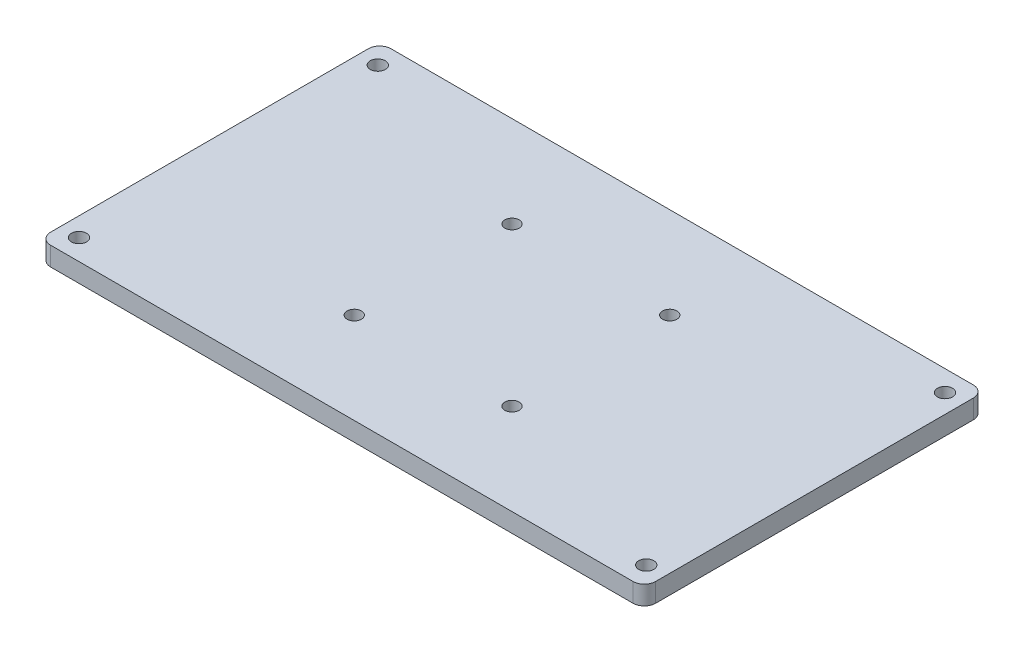
ISO-10303-21;
HEADER;
FILE_DESCRIPTION(('STEP AP214'),'2;1');
FILE_NAME('part.step','',(''),(''),'','','');
FILE_SCHEMA(('AUTOMOTIVE_DESIGN { 1 0 10303 214 1 1 1 1 }'));
ENDSEC;
DATA;
#1=APPLICATION_CONTEXT('core data for automotive mechanical design processes');
#2=APPLICATION_PROTOCOL_DEFINITION('international standard','automotive_design',2000,#1);
#3=PRODUCT_CONTEXT('',#1,'mechanical');
#4=PRODUCT('Part','Part','',(#3));
#5=PRODUCT_RELATED_PRODUCT_CATEGORY('part','',(#4));
#6=PRODUCT_DEFINITION_FORMATION('','',#4);
#7=PRODUCT_DEFINITION_CONTEXT('part definition',#1,'design');
#8=PRODUCT_DEFINITION('design','',#6,#7);
#9=PRODUCT_DEFINITION_SHAPE('','',#8);
#10=(LENGTH_UNIT() NAMED_UNIT(*) SI_UNIT(.MILLI.,.METRE.));
#11=(NAMED_UNIT(*) PLANE_ANGLE_UNIT() SI_UNIT($,.RADIAN.));
#12=(NAMED_UNIT(*) SI_UNIT($,.STERADIAN.) SOLID_ANGLE_UNIT());
#13=UNCERTAINTY_MEASURE_WITH_UNIT(LENGTH_MEASURE(1.E-05),#10,'distance_accuracy_value','');
#14=(GEOMETRIC_REPRESENTATION_CONTEXT(3) GLOBAL_UNCERTAINTY_ASSIGNED_CONTEXT((#13)) GLOBAL_UNIT_ASSIGNED_CONTEXT((#10,
#11,#12)) REPRESENTATION_CONTEXT('',''));
#15=CARTESIAN_POINT('',(0.,0.,0.));
#16=DIRECTION('',(0.,0.,1.));
#17=DIRECTION('',(1.,0.,0.));
#18=AXIS2_PLACEMENT_3D('',#15,#16,#17);
#19=CARTESIAN_POINT('',(0.,5.,0.));
#20=DIRECTION('',(0.,-1.,0.));
#21=DIRECTION('',(0.,0.,-1.));
#22=AXIS2_PLACEMENT_3D('',#19,#20,#21);
#23=PLANE('',#22);
#24=DIRECTION('',(-1.,0.,0.));
#25=VECTOR('',#24,1.);
#26=CARTESIAN_POINT('',(-80.,5.,-45.));
#27=LINE('',#26,#25);
#28=CARTESIAN_POINT('',(77.,5.,-45.));
#29=VERTEX_POINT('',#28);
#30=CARTESIAN_POINT('',(-77.,5.,-45.));
#31=VERTEX_POINT('',#30);
#32=EDGE_CURVE('E183',#29,#31,#27,.T.);
#33=ORIENTED_EDGE('',*,*,#32,.T.);
#34=CARTESIAN_POINT('',(-77.,5.,-42.));
#35=DIRECTION('',(0.,-1.,0.));
#36=DIRECTION('',(0.,0.,-1.));
#37=AXIS2_PLACEMENT_3D('',#34,#35,#36);
#38=CIRCLE('',#37,3.);
#39=CARTESIAN_POINT('',(-80.,5.,-42.));
#40=VERTEX_POINT('',#39);
#41=EDGE_CURVE('E169',#31,#40,#38,.F.);
#42=ORIENTED_EDGE('',*,*,#41,.T.);
#43=DIRECTION('',(0.,0.,1.));
#44=VECTOR('',#43,1.);
#45=CARTESIAN_POINT('',(-80.,5.,45.));
#46=LINE('',#45,#44);
#47=CARTESIAN_POINT('',(-80.,5.,42.));
#48=VERTEX_POINT('',#47);
#49=EDGE_CURVE('E126',#40,#48,#46,.T.);
#50=ORIENTED_EDGE('',*,*,#49,.T.);
#51=CARTESIAN_POINT('',(-77.,5.,42.));
#52=DIRECTION('',(0.,-1.,0.));
#53=DIRECTION('',(0.,0.,-1.));
#54=AXIS2_PLACEMENT_3D('',#51,#52,#53);
#55=CIRCLE('',#54,3.);
#56=CARTESIAN_POINT('',(-77.,5.,45.));
#57=VERTEX_POINT('',#56);
#58=EDGE_CURVE('E61',#48,#57,#55,.F.);
#59=ORIENTED_EDGE('',*,*,#58,.T.);
#60=DIRECTION('',(1.,0.,0.));
#61=VECTOR('',#60,1.);
#62=CARTESIAN_POINT('',(-80.,5.,45.));
#63=LINE('',#62,#61);
#64=CARTESIAN_POINT('',(77.,5.,45.));
#65=VERTEX_POINT('',#64);
#66=EDGE_CURVE('E148',#57,#65,#63,.T.);
#67=ORIENTED_EDGE('',*,*,#66,.T.);
#68=CARTESIAN_POINT('',(77.,5.,42.));
#69=DIRECTION('',(0.,-1.,0.));
#70=DIRECTION('',(0.,0.,-1.));
#71=AXIS2_PLACEMENT_3D('',#68,#69,#70);
#72=CIRCLE('',#71,3.);
#73=CARTESIAN_POINT('',(80.,5.,42.));
#74=VERTEX_POINT('',#73);
#75=EDGE_CURVE('E161',#65,#74,#72,.F.);
#76=ORIENTED_EDGE('',*,*,#75,.T.);
#77=DIRECTION('',(0.,0.,-1.));
#78=VECTOR('',#77,1.);
#79=CARTESIAN_POINT('',(80.,5.,45.));
#80=LINE('',#79,#78);
#81=CARTESIAN_POINT('',(80.,5.,-42.));
#82=VERTEX_POINT('',#81);
#83=EDGE_CURVE('E141',#74,#82,#80,.T.);
#84=ORIENTED_EDGE('',*,*,#83,.T.);
#85=CARTESIAN_POINT('',(77.,5.,-42.));
#86=DIRECTION('',(0.,-1.,0.));
#87=DIRECTION('',(0.,0.,-1.));
#88=AXIS2_PLACEMENT_3D('',#85,#86,#87);
#89=CIRCLE('',#88,3.);
#90=EDGE_CURVE('E166',#82,#29,#89,.F.);
#91=ORIENTED_EDGE('',*,*,#90,.T.);
#92=EDGE_LOOP('',(#33,#42,#50,#59,#67,#76,#84,#91));
#93=FACE_BOUND('',#92,.T.);
#94=CARTESIAN_POINT('',(20.859650045003,5.,-20.8596500450033));
#95=DIRECTION('',(0.,1.,0.));
#96=DIRECTION('',(0.,0.,1.));
#97=AXIS2_PLACEMENT_3D('',#94,#95,#96);
#98=CIRCLE('',#97,1.90000000000001);
#99=CARTESIAN_POINT('',(20.859650045003,5.,-18.9596500450033));
#100=VERTEX_POINT('',#99);
#101=EDGE_CURVE('E197',#100,#100,#98,.T.);
#102=ORIENTED_EDGE('',*,*,#101,.F.);
#103=EDGE_LOOP('',(#102));
#104=FACE_BOUND('',#103,.T.);
#105=CARTESIAN_POINT('',(20.8596500450044,5.,20.859650045003));
#106=DIRECTION('',(0.,1.,0.));
#107=DIRECTION('',(0.,0.,1.));
#108=AXIS2_PLACEMENT_3D('',#105,#106,#107);
#109=CIRCLE('',#108,1.9);
#110=CARTESIAN_POINT('',(20.8596500450044,5.,22.759650045003));
#111=VERTEX_POINT('',#110);
#112=EDGE_CURVE('E207',#111,#111,#109,.T.);
#113=ORIENTED_EDGE('',*,*,#112,.F.);
#114=EDGE_LOOP('',(#113));
#115=FACE_BOUND('',#114,.T.);
#116=CARTESIAN_POINT('',(-20.8596500450019,5.,20.8596500450044));
#117=DIRECTION('',(0.,1.,0.));
#118=DIRECTION('',(0.,0.,1.));
#119=AXIS2_PLACEMENT_3D('',#116,#117,#118);
#120=CIRCLE('',#119,1.9);
#121=CARTESIAN_POINT('',(-20.8596500450019,5.,22.7596500450044));
#122=VERTEX_POINT('',#121);
#123=EDGE_CURVE('E213',#122,#122,#120,.T.);
#124=ORIENTED_EDGE('',*,*,#123,.F.);
#125=EDGE_LOOP('',(#124));
#126=FACE_BOUND('',#125,.T.);
#127=CARTESIAN_POINT('',(-20.8596500450033,5.,-20.8596500450019));
#128=DIRECTION('',(0.,1.,0.));
#129=DIRECTION('',(0.,0.,1.));
#130=AXIS2_PLACEMENT_3D('',#127,#128,#129);
#131=CIRCLE('',#130,1.9);
#132=CARTESIAN_POINT('',(-20.8596500450033,5.,-18.9596500450019));
#133=VERTEX_POINT('',#132);
#134=EDGE_CURVE('E221',#133,#133,#131,.T.);
#135=ORIENTED_EDGE('',*,*,#134,.F.);
#136=EDGE_LOOP('',(#135));
#137=FACE_BOUND('',#136,.T.);
#138=CARTESIAN_POINT('',(-75.,5.,-39.5));
#139=DIRECTION('',(0.,1.,0.));
#140=DIRECTION('',(0.,0.,1.));
#141=AXIS2_PLACEMENT_3D('',#138,#139,#140);
#142=CIRCLE('',#141,2.);
#143=CARTESIAN_POINT('',(-75.,5.,-37.5));
#144=VERTEX_POINT('',#143);
#145=EDGE_CURVE('E229',#144,#144,#142,.T.);
#146=ORIENTED_EDGE('',*,*,#145,.F.);
#147=EDGE_LOOP('',(#146));
#148=FACE_BOUND('',#147,.T.);
#149=CARTESIAN_POINT('',(75.,5.,-39.5));
#150=DIRECTION('',(0.,1.,0.));
#151=DIRECTION('',(0.,0.,1.));
#152=AXIS2_PLACEMENT_3D('',#149,#150,#151);
#153=CIRCLE('',#152,2.);
#154=CARTESIAN_POINT('',(75.,5.,-37.5));
#155=VERTEX_POINT('',#154);
#156=EDGE_CURVE('E237',#155,#155,#153,.T.);
#157=ORIENTED_EDGE('',*,*,#156,.F.);
#158=EDGE_LOOP('',(#157));
#159=FACE_BOUND('',#158,.T.);
#160=CARTESIAN_POINT('',(75.,5.,39.5));
#161=DIRECTION('',(0.,1.,0.));
#162=DIRECTION('',(0.,0.,1.));
#163=AXIS2_PLACEMENT_3D('',#160,#161,#162);
#164=CIRCLE('',#163,2.);
#165=CARTESIAN_POINT('',(75.,5.,41.5));
#166=VERTEX_POINT('',#165);
#167=EDGE_CURVE('E245',#166,#166,#164,.T.);
#168=ORIENTED_EDGE('',*,*,#167,.F.);
#169=EDGE_LOOP('',(#168));
#170=FACE_BOUND('',#169,.T.);
#171=CARTESIAN_POINT('',(-75.,5.,39.5));
#172=DIRECTION('',(0.,1.,0.));
#173=DIRECTION('',(0.,0.,1.));
#174=AXIS2_PLACEMENT_3D('',#171,#172,#173);
#175=CIRCLE('',#174,2.);
#176=CARTESIAN_POINT('',(-75.,5.,41.5));
#177=VERTEX_POINT('',#176);
#178=EDGE_CURVE('E253',#177,#177,#175,.T.);
#179=ORIENTED_EDGE('',*,*,#178,.F.);
#180=EDGE_LOOP('',(#179));
#181=FACE_BOUND('',#180,.T.);
#182=ADVANCED_FACE('F39',(#93,#104,#115,#126,#137,#148,#159,#170,#181),#23,.F.);
#183=CARTESIAN_POINT('',(0.,0.,0.));
#184=DIRECTION('',(0.,-1.,0.));
#185=DIRECTION('',(0.,0.,-1.));
#186=AXIS2_PLACEMENT_3D('',#183,#184,#185);
#187=PLANE('',#186);
#188=CARTESIAN_POINT('',(75.,0.,39.5));
#189=DIRECTION('',(0.,1.,0.));
#190=DIRECTION('',(0.,0.,1.));
#191=AXIS2_PLACEMENT_3D('',#188,#189,#190);
#192=CIRCLE('',#191,2.);
#193=CARTESIAN_POINT('',(75.,0.,41.5));
#194=VERTEX_POINT('',#193);
#195=EDGE_CURVE('E249',#194,#194,#192,.T.);
#196=ORIENTED_EDGE('',*,*,#195,.T.);
#197=EDGE_LOOP('',(#196));
#198=FACE_BOUND('',#197,.T.);
#199=CARTESIAN_POINT('',(-75.,0.,-39.5));
#200=DIRECTION('',(0.,1.,0.));
#201=DIRECTION('',(0.,0.,1.));
#202=AXIS2_PLACEMENT_3D('',#199,#200,#201);
#203=CIRCLE('',#202,2.);
#204=CARTESIAN_POINT('',(-75.,0.,-37.5));
#205=VERTEX_POINT('',#204);
#206=EDGE_CURVE('E233',#205,#205,#203,.T.);
#207=ORIENTED_EDGE('',*,*,#206,.T.);
#208=EDGE_LOOP('',(#207));
#209=FACE_BOUND('',#208,.T.);
#210=CARTESIAN_POINT('',(-20.8596500450019,0.,20.8596500450044));
#211=DIRECTION('',(0.,1.,0.));
#212=DIRECTION('',(0.,0.,1.));
#213=AXIS2_PLACEMENT_3D('',#210,#211,#212);
#214=CIRCLE('',#213,1.9);
#215=CARTESIAN_POINT('',(-20.8596500450019,0.,22.7596500450044));
#216=VERTEX_POINT('',#215);
#217=EDGE_CURVE('E217',#216,#216,#214,.T.);
#218=ORIENTED_EDGE('',*,*,#217,.T.);
#219=EDGE_LOOP('',(#218));
#220=FACE_BOUND('',#219,.T.);
#221=CARTESIAN_POINT('',(20.859650045003,0.,-20.8596500450033));
#222=DIRECTION('',(0.,1.,0.));
#223=DIRECTION('',(0.,0.,1.));
#224=AXIS2_PLACEMENT_3D('',#221,#222,#223);
#225=CIRCLE('',#224,1.90000000000001);
#226=CARTESIAN_POINT('',(20.859650045003,0.,-18.9596500450033));
#227=VERTEX_POINT('',#226);
#228=EDGE_CURVE('E193',#227,#227,#225,.T.);
#229=ORIENTED_EDGE('',*,*,#228,.T.);
#230=EDGE_LOOP('',(#229));
#231=FACE_BOUND('',#230,.T.);
#232=DIRECTION('',(0.,0.,1.));
#233=VECTOR('',#232,1.);
#234=CARTESIAN_POINT('',(-80.,0.,45.));
#235=LINE('',#234,#233);
#236=CARTESIAN_POINT('',(-80.,0.,-42.));
#237=VERTEX_POINT('',#236);
#238=CARTESIAN_POINT('',(-80.,0.,42.));
#239=VERTEX_POINT('',#238);
#240=EDGE_CURVE('E124',#237,#239,#235,.T.);
#241=ORIENTED_EDGE('',*,*,#240,.F.);
#242=CARTESIAN_POINT('',(-77.,0.,-42.));
#243=DIRECTION('',(0.,-1.,0.));
#244=DIRECTION('',(0.,0.,-1.));
#245=AXIS2_PLACEMENT_3D('',#242,#243,#244);
#246=CIRCLE('',#245,3.);
#247=CARTESIAN_POINT('',(-77.,0.,-45.));
#248=VERTEX_POINT('',#247);
#249=EDGE_CURVE('E106',#237,#248,#246,.T.);
#250=ORIENTED_EDGE('',*,*,#249,.T.);
#251=DIRECTION('',(-1.,0.,0.));
#252=VECTOR('',#251,1.);
#253=CARTESIAN_POINT('',(-80.,0.,-45.));
#254=LINE('',#253,#252);
#255=CARTESIAN_POINT('',(77.,0.,-45.));
#256=VERTEX_POINT('',#255);
#257=EDGE_CURVE('E137',#256,#248,#254,.T.);
#258=ORIENTED_EDGE('',*,*,#257,.F.);
#259=CARTESIAN_POINT('',(77.,0.,-42.));
#260=DIRECTION('',(0.,-1.,0.));
#261=DIRECTION('',(0.,0.,-1.));
#262=AXIS2_PLACEMENT_3D('',#259,#260,#261);
#263=CIRCLE('',#262,3.);
#264=CARTESIAN_POINT('',(80.,0.,-42.));
#265=VERTEX_POINT('',#264);
#266=EDGE_CURVE('E118',#256,#265,#263,.T.);
#267=ORIENTED_EDGE('',*,*,#266,.T.);
#268=DIRECTION('',(0.,0.,-1.));
#269=VECTOR('',#268,1.);
#270=CARTESIAN_POINT('',(80.,0.,45.));
#271=LINE('',#270,#269);
#272=CARTESIAN_POINT('',(80.,0.,42.));
#273=VERTEX_POINT('',#272);
#274=EDGE_CURVE('E143',#273,#265,#271,.T.);
#275=ORIENTED_EDGE('',*,*,#274,.F.);
#276=CARTESIAN_POINT('',(77.,0.,42.));
#277=DIRECTION('',(0.,-1.,0.));
#278=DIRECTION('',(0.,0.,-1.));
#279=AXIS2_PLACEMENT_3D('',#276,#277,#278);
#280=CIRCLE('',#279,3.);
#281=CARTESIAN_POINT('',(77.,0.,45.));
#282=VERTEX_POINT('',#281);
#283=EDGE_CURVE('E128',#273,#282,#280,.T.);
#284=ORIENTED_EDGE('',*,*,#283,.T.);
#285=DIRECTION('',(1.,0.,0.));
#286=VECTOR('',#285,1.);
#287=CARTESIAN_POINT('',(-80.,0.,45.));
#288=LINE('',#287,#286);
#289=CARTESIAN_POINT('',(-77.,0.,45.));
#290=VERTEX_POINT('',#289);
#291=EDGE_CURVE('E136',#290,#282,#288,.T.);
#292=ORIENTED_EDGE('',*,*,#291,.F.);
#293=CARTESIAN_POINT('',(-77.,0.,42.));
#294=DIRECTION('',(0.,-1.,0.));
#295=DIRECTION('',(0.,0.,-1.));
#296=AXIS2_PLACEMENT_3D('',#293,#294,#295);
#297=CIRCLE('',#296,3.);
#298=EDGE_CURVE('E134',#290,#239,#297,.T.);
#299=ORIENTED_EDGE('',*,*,#298,.T.);
#300=EDGE_LOOP('',(#241,#250,#258,#267,#275,#284,#292,#299));
#301=FACE_BOUND('',#300,.T.);
#302=CARTESIAN_POINT('',(20.8596500450044,0.,20.859650045003));
#303=DIRECTION('',(0.,1.,0.));
#304=DIRECTION('',(0.,0.,1.));
#305=AXIS2_PLACEMENT_3D('',#302,#303,#304);
#306=CIRCLE('',#305,1.9);
#307=CARTESIAN_POINT('',(20.8596500450044,0.,22.759650045003));
#308=VERTEX_POINT('',#307);
#309=EDGE_CURVE('E209',#308,#308,#306,.T.);
#310=ORIENTED_EDGE('',*,*,#309,.T.);
#311=EDGE_LOOP('',(#310));
#312=FACE_BOUND('',#311,.T.);
#313=CARTESIAN_POINT('',(-20.8596500450033,0.,-20.8596500450019));
#314=DIRECTION('',(0.,1.,0.));
#315=DIRECTION('',(0.,0.,1.));
#316=AXIS2_PLACEMENT_3D('',#313,#314,#315);
#317=CIRCLE('',#316,1.9);
#318=CARTESIAN_POINT('',(-20.8596500450033,0.,-18.9596500450019));
#319=VERTEX_POINT('',#318);
#320=EDGE_CURVE('E225',#319,#319,#317,.T.);
#321=ORIENTED_EDGE('',*,*,#320,.T.);
#322=EDGE_LOOP('',(#321));
#323=FACE_BOUND('',#322,.T.);
#324=CARTESIAN_POINT('',(75.,0.,-39.5));
#325=DIRECTION('',(0.,1.,0.));
#326=DIRECTION('',(0.,0.,1.));
#327=AXIS2_PLACEMENT_3D('',#324,#325,#326);
#328=CIRCLE('',#327,2.);
#329=CARTESIAN_POINT('',(75.,0.,-37.5));
#330=VERTEX_POINT('',#329);
#331=EDGE_CURVE('E241',#330,#330,#328,.T.);
#332=ORIENTED_EDGE('',*,*,#331,.T.);
#333=EDGE_LOOP('',(#332));
#334=FACE_BOUND('',#333,.T.);
#335=CARTESIAN_POINT('',(-75.,0.,39.5));
#336=DIRECTION('',(0.,1.,0.));
#337=DIRECTION('',(0.,0.,1.));
#338=AXIS2_PLACEMENT_3D('',#335,#336,#337);
#339=CIRCLE('',#338,2.);
#340=CARTESIAN_POINT('',(-75.,0.,41.5));
#341=VERTEX_POINT('',#340);
#342=EDGE_CURVE('E257',#341,#341,#339,.T.);
#343=ORIENTED_EDGE('',*,*,#342,.T.);
#344=EDGE_LOOP('',(#343));
#345=FACE_BOUND('',#344,.T.);
#346=ADVANCED_FACE('F131',(#198,#209,#220,#231,#301,#312,#323,#334,#345),#187,.T.);
#347=CARTESIAN_POINT('',(80.,5.,45.));
#348=DIRECTION('',(-1.,0.,0.));
#349=DIRECTION('',(0.,0.,1.));
#350=AXIS2_PLACEMENT_3D('',#347,#348,#349);
#351=PLANE('',#350);
#352=ORIENTED_EDGE('',*,*,#274,.T.);
#353=DIRECTION('',(0.,-1.,0.));
#354=VECTOR('',#353,1.);
#355=CARTESIAN_POINT('',(80.,5.,-42.));
#356=LINE('',#355,#354);
#357=EDGE_CURVE('E176',#265,#82,#356,.F.);
#358=ORIENTED_EDGE('',*,*,#357,.T.);
#359=ORIENTED_EDGE('',*,*,#83,.F.);
#360=DIRECTION('',(0.,-1.,0.));
#361=VECTOR('',#360,1.);
#362=CARTESIAN_POINT('',(80.,5.,42.));
#363=LINE('',#362,#361);
#364=EDGE_CURVE('E172',#74,#273,#363,.T.);
#365=ORIENTED_EDGE('',*,*,#364,.T.);
#366=EDGE_LOOP('',(#352,#358,#359,#365));
#367=FACE_BOUND('',#366,.T.);
#368=ADVANCED_FACE('F273',(#367),#351,.F.);
#369=CARTESIAN_POINT('',(-80.,5.,-45.));
#370=DIRECTION('',(0.,0.,1.));
#371=DIRECTION('',(1.,0.,0.));
#372=AXIS2_PLACEMENT_3D('',#369,#370,#371);
#373=PLANE('',#372);
#374=ORIENTED_EDGE('',*,*,#257,.T.);
#375=DIRECTION('',(0.,-1.,0.));
#376=VECTOR('',#375,1.);
#377=CARTESIAN_POINT('',(-77.,5.,-45.));
#378=LINE('',#377,#376);
#379=EDGE_CURVE('E111',#248,#31,#378,.F.);
#380=ORIENTED_EDGE('',*,*,#379,.T.);
#381=ORIENTED_EDGE('',*,*,#32,.F.);
#382=DIRECTION('',(0.,-1.,0.));
#383=VECTOR('',#382,1.);
#384=CARTESIAN_POINT('',(77.,5.,-45.));
#385=LINE('',#384,#383);
#386=EDGE_CURVE('E117',#29,#256,#385,.T.);
#387=ORIENTED_EDGE('',*,*,#386,.T.);
#388=EDGE_LOOP('',(#374,#380,#381,#387));
#389=FACE_BOUND('',#388,.T.);
#390=ADVANCED_FACE('F286',(#389),#373,.F.);
#391=CARTESIAN_POINT('',(-80.,5.,45.));
#392=DIRECTION('',(1.,0.,0.));
#393=DIRECTION('',(0.,0.,-1.));
#394=AXIS2_PLACEMENT_3D('',#391,#392,#393);
#395=PLANE('',#394);
#396=ORIENTED_EDGE('',*,*,#49,.F.);
#397=DIRECTION('',(0.,-1.,0.));
#398=VECTOR('',#397,1.);
#399=CARTESIAN_POINT('',(-80.,5.,-42.));
#400=LINE('',#399,#398);
#401=EDGE_CURVE('E110',#40,#237,#400,.T.);
#402=ORIENTED_EDGE('',*,*,#401,.T.);
#403=ORIENTED_EDGE('',*,*,#240,.T.);
#404=DIRECTION('',(0.,-1.,0.));
#405=VECTOR('',#404,1.);
#406=CARTESIAN_POINT('',(-80.,5.,42.));
#407=LINE('',#406,#405);
#408=EDGE_CURVE('E129',#239,#48,#407,.F.);
#409=ORIENTED_EDGE('',*,*,#408,.T.);
#410=EDGE_LOOP('',(#396,#402,#403,#409));
#411=FACE_BOUND('',#410,.T.);
#412=ADVANCED_FACE('F123',(#411),#395,.F.);
#413=CARTESIAN_POINT('',(-80.,5.,45.));
#414=DIRECTION('',(0.,0.,-1.));
#415=DIRECTION('',(-1.,0.,0.));
#416=AXIS2_PLACEMENT_3D('',#413,#414,#415);
#417=PLANE('',#416);
#418=ORIENTED_EDGE('',*,*,#66,.F.);
#419=DIRECTION('',(0.,-1.,0.));
#420=VECTOR('',#419,1.);
#421=CARTESIAN_POINT('',(-77.,5.,45.));
#422=LINE('',#421,#420);
#423=EDGE_CURVE('E11',#57,#290,#422,.T.);
#424=ORIENTED_EDGE('',*,*,#423,.T.);
#425=ORIENTED_EDGE('',*,*,#291,.T.);
#426=DIRECTION('',(0.,-1.,0.));
#427=VECTOR('',#426,1.);
#428=CARTESIAN_POINT('',(77.,5.,45.));
#429=LINE('',#428,#427);
#430=EDGE_CURVE('E48',#282,#65,#429,.F.);
#431=ORIENTED_EDGE('',*,*,#430,.T.);
#432=EDGE_LOOP('',(#418,#424,#425,#431));
#433=FACE_BOUND('',#432,.T.);
#434=ADVANCED_FACE('F281',(#433),#417,.F.);
#435=CARTESIAN_POINT('',(20.859650045003,5.,-20.8596500450033));
#436=DIRECTION('',(0.,-1.,0.));
#437=DIRECTION('',(0.,0.,-1.));
#438=AXIS2_PLACEMENT_3D('',#435,#436,#437);
#439=CYLINDRICAL_SURFACE('',#438,1.90000000000001);
#440=ORIENTED_EDGE('',*,*,#101,.T.);
#441=EDGE_LOOP('',(#440));
#442=FACE_BOUND('',#441,.T.);
#443=ORIENTED_EDGE('',*,*,#228,.F.);
#444=EDGE_LOOP('',(#443));
#445=FACE_BOUND('',#444,.T.);
#446=ADVANCED_FACE('F278',(#442,#445),#439,.F.);
#447=CARTESIAN_POINT('',(20.8596500450044,5.,20.859650045003));
#448=DIRECTION('',(0.,-1.,0.));
#449=DIRECTION('',(0.,0.,-1.));
#450=AXIS2_PLACEMENT_3D('',#447,#448,#449);
#451=CYLINDRICAL_SURFACE('',#450,1.9);
#452=ORIENTED_EDGE('',*,*,#112,.T.);
#453=EDGE_LOOP('',(#452));
#454=FACE_BOUND('',#453,.T.);
#455=ORIENTED_EDGE('',*,*,#309,.F.);
#456=EDGE_LOOP('',(#455));
#457=FACE_BOUND('',#456,.T.);
#458=ADVANCED_FACE('F421',(#454,#457),#451,.F.);
#459=CARTESIAN_POINT('',(-20.8596500450019,5.,20.8596500450044));
#460=DIRECTION('',(0.,-1.,0.));
#461=DIRECTION('',(0.,0.,-1.));
#462=AXIS2_PLACEMENT_3D('',#459,#460,#461);
#463=CYLINDRICAL_SURFACE('',#462,1.9);
#464=ORIENTED_EDGE('',*,*,#123,.T.);
#465=EDGE_LOOP('',(#464));
#466=FACE_BOUND('',#465,.T.);
#467=ORIENTED_EDGE('',*,*,#217,.F.);
#468=EDGE_LOOP('',(#467));
#469=FACE_BOUND('',#468,.T.);
#470=ADVANCED_FACE('F411',(#466,#469),#463,.F.);
#471=CARTESIAN_POINT('',(-20.8596500450033,5.,-20.8596500450019));
#472=DIRECTION('',(0.,-1.,0.));
#473=DIRECTION('',(0.,0.,-1.));
#474=AXIS2_PLACEMENT_3D('',#471,#472,#473);
#475=CYLINDRICAL_SURFACE('',#474,1.9);
#476=ORIENTED_EDGE('',*,*,#134,.T.);
#477=EDGE_LOOP('',(#476));
#478=FACE_BOUND('',#477,.T.);
#479=ORIENTED_EDGE('',*,*,#320,.F.);
#480=EDGE_LOOP('',(#479));
#481=FACE_BOUND('',#480,.T.);
#482=ADVANCED_FACE('F401',(#478,#481),#475,.F.);
#483=CARTESIAN_POINT('',(-75.,5.,-39.5));
#484=DIRECTION('',(0.,-1.,0.));
#485=DIRECTION('',(0.,0.,-1.));
#486=AXIS2_PLACEMENT_3D('',#483,#484,#485);
#487=CYLINDRICAL_SURFACE('',#486,2.);
#488=ORIENTED_EDGE('',*,*,#145,.T.);
#489=EDGE_LOOP('',(#488));
#490=FACE_BOUND('',#489,.T.);
#491=ORIENTED_EDGE('',*,*,#206,.F.);
#492=EDGE_LOOP('',(#491));
#493=FACE_BOUND('',#492,.T.);
#494=ADVANCED_FACE('F391',(#490,#493),#487,.F.);
#495=CARTESIAN_POINT('',(75.,5.,-39.5));
#496=DIRECTION('',(0.,-1.,0.));
#497=DIRECTION('',(0.,0.,-1.));
#498=AXIS2_PLACEMENT_3D('',#495,#496,#497);
#499=CYLINDRICAL_SURFACE('',#498,2.);
#500=ORIENTED_EDGE('',*,*,#156,.T.);
#501=EDGE_LOOP('',(#500));
#502=FACE_BOUND('',#501,.T.);
#503=ORIENTED_EDGE('',*,*,#331,.F.);
#504=EDGE_LOOP('',(#503));
#505=FACE_BOUND('',#504,.T.);
#506=ADVANCED_FACE('F381',(#502,#505),#499,.F.);
#507=CARTESIAN_POINT('',(75.,5.,39.5));
#508=DIRECTION('',(0.,-1.,0.));
#509=DIRECTION('',(0.,0.,-1.));
#510=AXIS2_PLACEMENT_3D('',#507,#508,#509);
#511=CYLINDRICAL_SURFACE('',#510,2.);
#512=ORIENTED_EDGE('',*,*,#167,.T.);
#513=EDGE_LOOP('',(#512));
#514=FACE_BOUND('',#513,.T.);
#515=ORIENTED_EDGE('',*,*,#195,.F.);
#516=EDGE_LOOP('',(#515));
#517=FACE_BOUND('',#516,.T.);
#518=ADVANCED_FACE('F372',(#514,#517),#511,.F.);
#519=CARTESIAN_POINT('',(-75.,5.,39.5));
#520=DIRECTION('',(0.,-1.,0.));
#521=DIRECTION('',(0.,0.,-1.));
#522=AXIS2_PLACEMENT_3D('',#519,#520,#521);
#523=CYLINDRICAL_SURFACE('',#522,2.);
#524=ORIENTED_EDGE('',*,*,#178,.T.);
#525=EDGE_LOOP('',(#524));
#526=FACE_BOUND('',#525,.T.);
#527=ORIENTED_EDGE('',*,*,#342,.F.);
#528=EDGE_LOOP('',(#527));
#529=FACE_BOUND('',#528,.T.);
#530=ADVANCED_FACE('F265',(#526,#529),#523,.F.);
#531=CARTESIAN_POINT('',(-77.,5.,-42.));
#532=DIRECTION('',(0.,-1.,0.));
#533=DIRECTION('',(0.,0.,-1.));
#534=AXIS2_PLACEMENT_3D('',#531,#532,#533);
#535=CYLINDRICAL_SURFACE('',#534,3.);
#536=ORIENTED_EDGE('',*,*,#41,.F.);
#537=ORIENTED_EDGE('',*,*,#379,.F.);
#538=ORIENTED_EDGE('',*,*,#249,.F.);
#539=ORIENTED_EDGE('',*,*,#401,.F.);
#540=EDGE_LOOP('',(#536,#537,#538,#539));
#541=FACE_BOUND('',#540,.T.);
#542=ADVANCED_FACE('F109',(#541),#535,.T.);
#543=CARTESIAN_POINT('',(77.,5.,-42.));
#544=DIRECTION('',(0.,-1.,0.));
#545=DIRECTION('',(0.,0.,-1.));
#546=AXIS2_PLACEMENT_3D('',#543,#544,#545);
#547=CYLINDRICAL_SURFACE('',#546,3.);
#548=ORIENTED_EDGE('',*,*,#90,.F.);
#549=ORIENTED_EDGE('',*,*,#357,.F.);
#550=ORIENTED_EDGE('',*,*,#266,.F.);
#551=ORIENTED_EDGE('',*,*,#386,.F.);
#552=EDGE_LOOP('',(#548,#549,#550,#551));
#553=FACE_BOUND('',#552,.T.);
#554=ADVANCED_FACE('F294',(#553),#547,.T.);
#555=CARTESIAN_POINT('',(-77.,5.,42.));
#556=DIRECTION('',(0.,-1.,0.));
#557=DIRECTION('',(0.,0.,-1.));
#558=AXIS2_PLACEMENT_3D('',#555,#556,#557);
#559=CYLINDRICAL_SURFACE('',#558,3.);
#560=ORIENTED_EDGE('',*,*,#58,.F.);
#561=ORIENTED_EDGE('',*,*,#408,.F.);
#562=ORIENTED_EDGE('',*,*,#298,.F.);
#563=ORIENTED_EDGE('',*,*,#423,.F.);
#564=EDGE_LOOP('',(#560,#561,#562,#563));
#565=FACE_BOUND('',#564,.T.);
#566=ADVANCED_FACE('F296',(#565),#559,.T.);
#567=CARTESIAN_POINT('',(77.,5.,42.));
#568=DIRECTION('',(0.,-1.,0.));
#569=DIRECTION('',(0.,0.,-1.));
#570=AXIS2_PLACEMENT_3D('',#567,#568,#569);
#571=CYLINDRICAL_SURFACE('',#570,3.);
#572=ORIENTED_EDGE('',*,*,#75,.F.);
#573=ORIENTED_EDGE('',*,*,#430,.F.);
#574=ORIENTED_EDGE('',*,*,#283,.F.);
#575=ORIENTED_EDGE('',*,*,#364,.F.);
#576=EDGE_LOOP('',(#572,#573,#574,#575));
#577=FACE_BOUND('',#576,.T.);
#578=ADVANCED_FACE('F41',(#577),#571,.T.);
#579=CLOSED_SHELL('',(#182,#346,#368,#390,#412,#434,#446,#458,#470,#482,#494,#506,#518,#530,
#542,#554,#566,#578));
#580=MANIFOLD_SOLID_BREP('B2',#579);
#581=ADVANCED_BREP_SHAPE_REPRESENTATION('',(#18,#580),#14);
#582=SHAPE_DEFINITION_REPRESENTATION(#9,#581);
ENDSEC;
END-ISO-10303-21;
